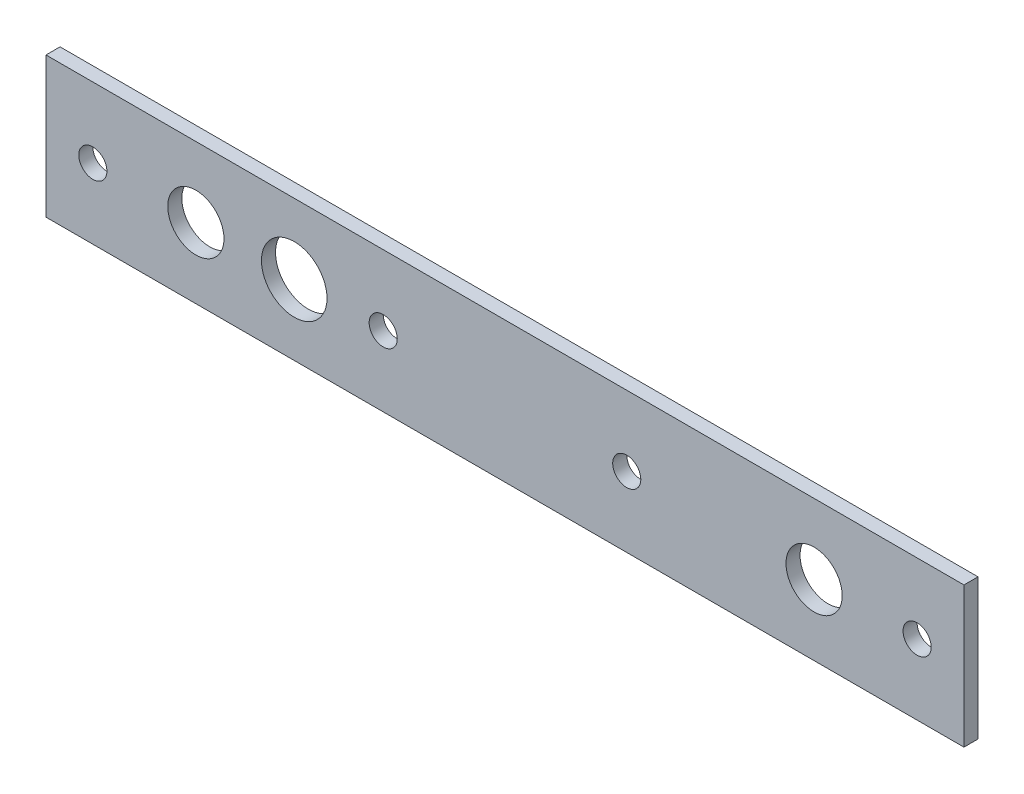
ISO-10303-21;
HEADER;
FILE_DESCRIPTION(('STEP AP214'),'2;1');
FILE_NAME('part.step','',(''),(''),'','','');
FILE_SCHEMA(('AUTOMOTIVE_DESIGN { 1 0 10303 214 1 1 1 1 }'));
ENDSEC;
DATA;
#1=APPLICATION_CONTEXT('core data for automotive mechanical design processes');
#2=APPLICATION_PROTOCOL_DEFINITION('international standard','automotive_design',2000,#1);
#3=PRODUCT_CONTEXT('',#1,'mechanical');
#4=PRODUCT('Part','Part','',(#3));
#5=PRODUCT_RELATED_PRODUCT_CATEGORY('part','',(#4));
#6=PRODUCT_DEFINITION_FORMATION('','',#4);
#7=PRODUCT_DEFINITION_CONTEXT('part definition',#1,'design');
#8=PRODUCT_DEFINITION('design','',#6,#7);
#9=PRODUCT_DEFINITION_SHAPE('','',#8);
#10=(LENGTH_UNIT() NAMED_UNIT(*) SI_UNIT(.MILLI.,.METRE.));
#11=(NAMED_UNIT(*) PLANE_ANGLE_UNIT() SI_UNIT($,.RADIAN.));
#12=(NAMED_UNIT(*) SI_UNIT($,.STERADIAN.) SOLID_ANGLE_UNIT());
#13=UNCERTAINTY_MEASURE_WITH_UNIT(LENGTH_MEASURE(1.E-05),#10,'distance_accuracy_value','');
#14=(GEOMETRIC_REPRESENTATION_CONTEXT(3) GLOBAL_UNCERTAINTY_ASSIGNED_CONTEXT((#13)) GLOBAL_UNIT_ASSIGNED_CONTEXT((#10,
#11,#12)) REPRESENTATION_CONTEXT('',''));
#15=CARTESIAN_POINT('',(0.,0.,0.));
#16=DIRECTION('',(0.,0.,1.));
#17=DIRECTION('',(1.,0.,0.));
#18=AXIS2_PLACEMENT_3D('',#15,#16,#17);
#19=CARTESIAN_POINT('',(53.1831030938484,-21.8181052631579,1.5));
#20=DIRECTION('',(0.,0.,-1.));
#21=DIRECTION('',(-1.,0.,0.));
#22=AXIS2_PLACEMENT_3D('',#19,#20,#21);
#23=PLANE('',#22);
#24=CARTESIAN_POINT('',(48.1831030938484,-14.3181052631579,1.5));
#25=DIRECTION('',(0.,0.,1.));
#26=DIRECTION('',(1.,0.,0.));
#27=AXIS2_PLACEMENT_3D('',#24,#25,#26);
#28=CIRCLE('',#27,1.5);
#29=CARTESIAN_POINT('',(49.6831030938484,-14.3181052631579,1.5));
#30=VERTEX_POINT('',#29);
#31=EDGE_CURVE('E136',#30,#30,#28,.T.);
#32=ORIENTED_EDGE('',*,*,#31,.F.);
#33=EDGE_LOOP('',(#32));
#34=FACE_BOUND('',#33,.T.);
#35=CARTESIAN_POINT('',(-28.8168969061516,-14.3181052631579,1.5));
#36=DIRECTION('',(0.,0.,1.));
#37=DIRECTION('',(1.,0.,0.));
#38=AXIS2_PLACEMENT_3D('',#35,#36,#37);
#39=CIRCLE('',#38,3.);
#40=CARTESIAN_POINT('',(-25.8168969061516,-14.3181052631579,1.5));
#41=VERTEX_POINT('',#40);
#42=EDGE_CURVE('E124',#41,#41,#39,.T.);
#43=ORIENTED_EDGE('',*,*,#42,.F.);
#44=EDGE_LOOP('',(#43));
#45=FACE_BOUND('',#44,.T.);
#46=CARTESIAN_POINT('',(-8.81689690615157,-14.3181052631579,1.5));
#47=DIRECTION('',(0.,0.,1.));
#48=DIRECTION('',(1.,0.,0.));
#49=AXIS2_PLACEMENT_3D('',#46,#47,#48);
#50=CIRCLE('',#49,1.5);
#51=CARTESIAN_POINT('',(-7.31689690615156,-14.3181052631579,1.5));
#52=VERTEX_POINT('',#51);
#53=EDGE_CURVE('E112',#52,#52,#50,.T.);
#54=ORIENTED_EDGE('',*,*,#53,.F.);
#55=EDGE_LOOP('',(#54));
#56=FACE_BOUND('',#55,.T.);
#57=DIRECTION('',(0.,1.,0.));
#58=VECTOR('',#57,1.);
#59=CARTESIAN_POINT('',(53.1831030938484,-6.81810526315789,1.5));
#60=LINE('',#59,#58);
#61=CARTESIAN_POINT('',(53.1831030938484,-21.8181052631579,1.5));
#62=VERTEX_POINT('',#61);
#63=CARTESIAN_POINT('',(53.1831030938484,-6.81810526315789,1.5));
#64=VERTEX_POINT('',#63);
#65=EDGE_CURVE('E82',#62,#64,#60,.T.);
#66=ORIENTED_EDGE('',*,*,#65,.T.);
#67=DIRECTION('',(-1.,0.,0.));
#68=VECTOR('',#67,1.);
#69=CARTESIAN_POINT('',(-44.8168969061516,-6.81810526315789,1.5));
#70=LINE('',#69,#68);
#71=CARTESIAN_POINT('',(-44.8168969061516,-6.81810526315789,1.5));
#72=VERTEX_POINT('',#71);
#73=EDGE_CURVE('E77',#64,#72,#70,.T.);
#74=ORIENTED_EDGE('',*,*,#73,.T.);
#75=DIRECTION('',(0.,-1.,0.));
#76=VECTOR('',#75,1.);
#77=CARTESIAN_POINT('',(-44.8168969061516,-21.8181052631579,1.5));
#78=LINE('',#77,#76);
#79=CARTESIAN_POINT('',(-44.8168969061516,-21.8181052631579,1.5));
#80=VERTEX_POINT('',#79);
#81=EDGE_CURVE('E80',#72,#80,#78,.T.);
#82=ORIENTED_EDGE('',*,*,#81,.T.);
#83=DIRECTION('',(1.,0.,0.));
#84=VECTOR('',#83,1.);
#85=CARTESIAN_POINT('',(53.1831030938484,-21.8181052631579,1.5));
#86=LINE('',#85,#84);
#87=EDGE_CURVE('E47',#80,#62,#86,.T.);
#88=ORIENTED_EDGE('',*,*,#87,.T.);
#89=EDGE_LOOP('',(#66,#74,#82,#88));
#90=FACE_BOUND('',#89,.T.);
#91=CARTESIAN_POINT('',(37.1831030938484,-14.3181052631579,1.5));
#92=DIRECTION('',(0.,0.,1.));
#93=DIRECTION('',(1.,0.,0.));
#94=AXIS2_PLACEMENT_3D('',#91,#92,#93);
#95=CIRCLE('',#94,3.);
#96=CARTESIAN_POINT('',(40.1831030938484,-14.3181052631579,1.5));
#97=VERTEX_POINT('',#96);
#98=EDGE_CURVE('E97',#97,#97,#95,.T.);
#99=ORIENTED_EDGE('',*,*,#98,.F.);
#100=EDGE_LOOP('',(#99));
#101=FACE_BOUND('',#100,.T.);
#102=CARTESIAN_POINT('',(17.1831030938484,-14.3181052631579,1.5));
#103=DIRECTION('',(0.,0.,1.));
#104=DIRECTION('',(1.,0.,0.));
#105=AXIS2_PLACEMENT_3D('',#102,#103,#104);
#106=CIRCLE('',#105,1.5);
#107=CARTESIAN_POINT('',(18.6831030938484,-14.3181052631579,1.5));
#108=VERTEX_POINT('',#107);
#109=EDGE_CURVE('E118',#108,#108,#106,.T.);
#110=ORIENTED_EDGE('',*,*,#109,.F.);
#111=EDGE_LOOP('',(#110));
#112=FACE_BOUND('',#111,.T.);
#113=CARTESIAN_POINT('',(-18.3168969061516,-14.3181052631579,1.5));
#114=DIRECTION('',(0.,0.,1.));
#115=DIRECTION('',(1.,0.,0.));
#116=AXIS2_PLACEMENT_3D('',#113,#114,#115);
#117=CIRCLE('',#116,3.5);
#118=CARTESIAN_POINT('',(-14.8168969061516,-14.3181052631579,1.5));
#119=VERTEX_POINT('',#118);
#120=EDGE_CURVE('E130',#119,#119,#117,.T.);
#121=ORIENTED_EDGE('',*,*,#120,.F.);
#122=EDGE_LOOP('',(#121));
#123=FACE_BOUND('',#122,.T.);
#124=CARTESIAN_POINT('',(-39.8168969061516,-14.3181052631579,1.5));
#125=DIRECTION('',(0.,0.,1.));
#126=DIRECTION('',(1.,0.,0.));
#127=AXIS2_PLACEMENT_3D('',#124,#125,#126);
#128=CIRCLE('',#127,1.5);
#129=CARTESIAN_POINT('',(-38.3168969061516,-14.3181052631579,1.5));
#130=VERTEX_POINT('',#129);
#131=EDGE_CURVE('E142',#130,#130,#128,.T.);
#132=ORIENTED_EDGE('',*,*,#131,.F.);
#133=EDGE_LOOP('',(#132));
#134=FACE_BOUND('',#133,.T.);
#135=ADVANCED_FACE('F30',(#34,#45,#56,#90,#101,#112,#123,#134),#23,.F.);
#136=CARTESIAN_POINT('',(53.1831030938484,-21.8181052631579,0.));
#137=DIRECTION('',(0.,0.,-1.));
#138=DIRECTION('',(-1.,0.,0.));
#139=AXIS2_PLACEMENT_3D('',#136,#137,#138);
#140=PLANE('',#139);
#141=CARTESIAN_POINT('',(48.1831030938484,-14.3181052631579,0.));
#142=DIRECTION('',(0.,0.,1.));
#143=DIRECTION('',(1.,0.,0.));
#144=AXIS2_PLACEMENT_3D('',#141,#142,#143);
#145=CIRCLE('',#144,1.5);
#146=CARTESIAN_POINT('',(49.6831030938484,-14.3181052631579,0.));
#147=VERTEX_POINT('',#146);
#148=EDGE_CURVE('E139',#147,#147,#145,.T.);
#149=ORIENTED_EDGE('',*,*,#148,.T.);
#150=EDGE_LOOP('',(#149));
#151=FACE_BOUND('',#150,.T.);
#152=CARTESIAN_POINT('',(-28.8168969061516,-14.3181052631579,0.));
#153=DIRECTION('',(0.,0.,1.));
#154=DIRECTION('',(1.,0.,0.));
#155=AXIS2_PLACEMENT_3D('',#152,#153,#154);
#156=CIRCLE('',#155,3.);
#157=CARTESIAN_POINT('',(-25.8168969061516,-14.3181052631579,0.));
#158=VERTEX_POINT('',#157);
#159=EDGE_CURVE('E127',#158,#158,#156,.T.);
#160=ORIENTED_EDGE('',*,*,#159,.T.);
#161=EDGE_LOOP('',(#160));
#162=FACE_BOUND('',#161,.T.);
#163=CARTESIAN_POINT('',(-8.81689690615157,-14.3181052631579,0.));
#164=DIRECTION('',(0.,0.,1.));
#165=DIRECTION('',(1.,0.,0.));
#166=AXIS2_PLACEMENT_3D('',#163,#164,#165);
#167=CIRCLE('',#166,1.5);
#168=CARTESIAN_POINT('',(-7.31689690615156,-14.3181052631579,0.));
#169=VERTEX_POINT('',#168);
#170=EDGE_CURVE('E115',#169,#169,#167,.T.);
#171=ORIENTED_EDGE('',*,*,#170,.T.);
#172=EDGE_LOOP('',(#171));
#173=FACE_BOUND('',#172,.T.);
#174=DIRECTION('',(0.,1.,0.));
#175=VECTOR('',#174,1.);
#176=CARTESIAN_POINT('',(53.1831030938484,-6.81810526315789,0.));
#177=LINE('',#176,#175);
#178=CARTESIAN_POINT('',(53.1831030938484,-21.8181052631579,0.));
#179=VERTEX_POINT('',#178);
#180=CARTESIAN_POINT('',(53.1831030938484,-6.81810526315789,0.));
#181=VERTEX_POINT('',#180);
#182=EDGE_CURVE('E94',#179,#181,#177,.T.);
#183=ORIENTED_EDGE('',*,*,#182,.F.);
#184=DIRECTION('',(1.,0.,0.));
#185=VECTOR('',#184,1.);
#186=CARTESIAN_POINT('',(53.1831030938484,-21.8181052631579,0.));
#187=LINE('',#186,#185);
#188=CARTESIAN_POINT('',(-44.8168969061516,-21.8181052631579,0.));
#189=VERTEX_POINT('',#188);
#190=EDGE_CURVE('E70',#189,#179,#187,.T.);
#191=ORIENTED_EDGE('',*,*,#190,.F.);
#192=DIRECTION('',(0.,-1.,0.));
#193=VECTOR('',#192,1.);
#194=CARTESIAN_POINT('',(-44.8168969061516,-21.8181052631579,0.));
#195=LINE('',#194,#193);
#196=CARTESIAN_POINT('',(-44.8168969061516,-6.81810526315789,0.));
#197=VERTEX_POINT('',#196);
#198=EDGE_CURVE('E64',#197,#189,#195,.T.);
#199=ORIENTED_EDGE('',*,*,#198,.F.);
#200=DIRECTION('',(-1.,0.,0.));
#201=VECTOR('',#200,1.);
#202=CARTESIAN_POINT('',(-44.8168969061516,-6.81810526315789,0.));
#203=LINE('',#202,#201);
#204=EDGE_CURVE('E86',#181,#197,#203,.T.);
#205=ORIENTED_EDGE('',*,*,#204,.F.);
#206=EDGE_LOOP('',(#183,#191,#199,#205));
#207=FACE_BOUND('',#206,.T.);
#208=CARTESIAN_POINT('',(37.1831030938484,-14.3181052631579,0.));
#209=DIRECTION('',(0.,0.,1.));
#210=DIRECTION('',(1.,0.,0.));
#211=AXIS2_PLACEMENT_3D('',#208,#209,#210);
#212=CIRCLE('',#211,3.);
#213=CARTESIAN_POINT('',(40.1831030938484,-14.3181052631579,0.));
#214=VERTEX_POINT('',#213);
#215=EDGE_CURVE('E109',#214,#214,#212,.T.);
#216=ORIENTED_EDGE('',*,*,#215,.T.);
#217=EDGE_LOOP('',(#216));
#218=FACE_BOUND('',#217,.T.);
#219=CARTESIAN_POINT('',(17.1831030938484,-14.3181052631579,0.));
#220=DIRECTION('',(0.,0.,1.));
#221=DIRECTION('',(1.,0.,0.));
#222=AXIS2_PLACEMENT_3D('',#219,#220,#221);
#223=CIRCLE('',#222,1.5);
#224=CARTESIAN_POINT('',(18.6831030938484,-14.3181052631579,0.));
#225=VERTEX_POINT('',#224);
#226=EDGE_CURVE('E121',#225,#225,#223,.T.);
#227=ORIENTED_EDGE('',*,*,#226,.T.);
#228=EDGE_LOOP('',(#227));
#229=FACE_BOUND('',#228,.T.);
#230=CARTESIAN_POINT('',(-18.3168969061516,-14.3181052631579,0.));
#231=DIRECTION('',(0.,0.,1.));
#232=DIRECTION('',(1.,0.,0.));
#233=AXIS2_PLACEMENT_3D('',#230,#231,#232);
#234=CIRCLE('',#233,3.5);
#235=CARTESIAN_POINT('',(-14.8168969061516,-14.3181052631579,0.));
#236=VERTEX_POINT('',#235);
#237=EDGE_CURVE('E133',#236,#236,#234,.T.);
#238=ORIENTED_EDGE('',*,*,#237,.T.);
#239=EDGE_LOOP('',(#238));
#240=FACE_BOUND('',#239,.T.);
#241=CARTESIAN_POINT('',(-39.8168969061516,-14.3181052631579,0.));
#242=DIRECTION('',(0.,0.,1.));
#243=DIRECTION('',(1.,0.,0.));
#244=AXIS2_PLACEMENT_3D('',#241,#242,#243);
#245=CIRCLE('',#244,1.5);
#246=CARTESIAN_POINT('',(-38.3168969061516,-14.3181052631579,0.));
#247=VERTEX_POINT('',#246);
#248=EDGE_CURVE('E145',#247,#247,#245,.T.);
#249=ORIENTED_EDGE('',*,*,#248,.T.);
#250=EDGE_LOOP('',(#249));
#251=FACE_BOUND('',#250,.T.);
#252=ADVANCED_FACE('F105',(#151,#162,#173,#207,#218,#229,#240,#251),#140,.T.);
#253=CARTESIAN_POINT('',(53.1831030938484,-6.81810526315789,1.5));
#254=DIRECTION('',(-1.,0.,0.));
#255=DIRECTION('',(0.,0.,1.));
#256=AXIS2_PLACEMENT_3D('',#253,#254,#255);
#257=PLANE('',#256);
#258=ORIENTED_EDGE('',*,*,#182,.T.);
#259=DIRECTION('',(0.,0.,-1.));
#260=VECTOR('',#259,1.);
#261=CARTESIAN_POINT('',(53.1831030938484,-6.81810526315789,1.5));
#262=LINE('',#261,#260);
#263=EDGE_CURVE('E11',#64,#181,#262,.T.);
#264=ORIENTED_EDGE('',*,*,#263,.F.);
#265=ORIENTED_EDGE('',*,*,#65,.F.);
#266=DIRECTION('',(0.,0.,-1.));
#267=VECTOR('',#266,1.);
#268=CARTESIAN_POINT('',(53.1831030938484,-21.8181052631579,1.5));
#269=LINE('',#268,#267);
#270=EDGE_CURVE('E90',#62,#179,#269,.T.);
#271=ORIENTED_EDGE('',*,*,#270,.T.);
#272=EDGE_LOOP('',(#258,#264,#265,#271));
#273=FACE_BOUND('',#272,.T.);
#274=ADVANCED_FACE('F32',(#273),#257,.F.);
#275=CARTESIAN_POINT('',(-44.8168969061516,-6.81810526315789,1.5));
#276=DIRECTION('',(0.,-1.,0.));
#277=DIRECTION('',(0.,0.,-1.));
#278=AXIS2_PLACEMENT_3D('',#275,#276,#277);
#279=PLANE('',#278);
#280=ORIENTED_EDGE('',*,*,#204,.T.);
#281=DIRECTION('',(0.,0.,-1.));
#282=VECTOR('',#281,1.);
#283=CARTESIAN_POINT('',(-44.8168969061516,-6.81810526315789,1.5));
#284=LINE('',#283,#282);
#285=EDGE_CURVE('E39',#72,#197,#284,.T.);
#286=ORIENTED_EDGE('',*,*,#285,.F.);
#287=ORIENTED_EDGE('',*,*,#73,.F.);
#288=ORIENTED_EDGE('',*,*,#263,.T.);
#289=EDGE_LOOP('',(#280,#286,#287,#288));
#290=FACE_BOUND('',#289,.T.);
#291=ADVANCED_FACE('F85',(#290),#279,.F.);
#292=CARTESIAN_POINT('',(-44.8168969061516,-21.8181052631579,1.5));
#293=DIRECTION('',(1.,0.,0.));
#294=DIRECTION('',(0.,0.,-1.));
#295=AXIS2_PLACEMENT_3D('',#292,#293,#294);
#296=PLANE('',#295);
#297=ORIENTED_EDGE('',*,*,#198,.T.);
#298=DIRECTION('',(0.,0.,-1.));
#299=VECTOR('',#298,1.);
#300=CARTESIAN_POINT('',(-44.8168969061516,-21.8181052631579,1.5));
#301=LINE('',#300,#299);
#302=EDGE_CURVE('E87',#80,#189,#301,.T.);
#303=ORIENTED_EDGE('',*,*,#302,.F.);
#304=ORIENTED_EDGE('',*,*,#81,.F.);
#305=ORIENTED_EDGE('',*,*,#285,.T.);
#306=EDGE_LOOP('',(#297,#303,#304,#305));
#307=FACE_BOUND('',#306,.T.);
#308=ADVANCED_FACE('F88',(#307),#296,.F.);
#309=CARTESIAN_POINT('',(53.1831030938484,-21.8181052631579,1.5));
#310=DIRECTION('',(0.,1.,0.));
#311=DIRECTION('',(-1.,0.,0.));
#312=AXIS2_PLACEMENT_3D('',#309,#310,#311);
#313=PLANE('',#312);
#314=ORIENTED_EDGE('',*,*,#190,.T.);
#315=ORIENTED_EDGE('',*,*,#270,.F.);
#316=ORIENTED_EDGE('',*,*,#87,.F.);
#317=ORIENTED_EDGE('',*,*,#302,.T.);
#318=EDGE_LOOP('',(#314,#315,#316,#317));
#319=FACE_BOUND('',#318,.T.);
#320=ADVANCED_FACE('F102',(#319),#313,.F.);
#321=CARTESIAN_POINT('',(37.1831030938484,-14.3181052631579,1.5));
#322=DIRECTION('',(0.,0.,-1.));
#323=DIRECTION('',(-1.,0.,0.));
#324=AXIS2_PLACEMENT_3D('',#321,#322,#323);
#325=CYLINDRICAL_SURFACE('',#324,3.);
#326=ORIENTED_EDGE('',*,*,#98,.T.);
#327=EDGE_LOOP('',(#326));
#328=FACE_BOUND('',#327,.T.);
#329=ORIENTED_EDGE('',*,*,#215,.F.);
#330=EDGE_LOOP('',(#329));
#331=FACE_BOUND('',#330,.T.);
#332=ADVANCED_FACE('F165',(#328,#331),#325,.F.);
#333=CARTESIAN_POINT('',(-8.81689690615157,-14.3181052631579,1.5));
#334=DIRECTION('',(0.,0.,-1.));
#335=DIRECTION('',(-1.,0.,0.));
#336=AXIS2_PLACEMENT_3D('',#333,#334,#335);
#337=CYLINDRICAL_SURFACE('',#336,1.5);
#338=ORIENTED_EDGE('',*,*,#53,.T.);
#339=EDGE_LOOP('',(#338));
#340=FACE_BOUND('',#339,.T.);
#341=ORIENTED_EDGE('',*,*,#170,.F.);
#342=EDGE_LOOP('',(#341));
#343=FACE_BOUND('',#342,.T.);
#344=ADVANCED_FACE('F211',(#340,#343),#337,.F.);
#345=CARTESIAN_POINT('',(17.1831030938484,-14.3181052631579,1.5));
#346=DIRECTION('',(0.,0.,-1.));
#347=DIRECTION('',(-1.,0.,0.));
#348=AXIS2_PLACEMENT_3D('',#345,#346,#347);
#349=CYLINDRICAL_SURFACE('',#348,1.5);
#350=ORIENTED_EDGE('',*,*,#109,.T.);
#351=EDGE_LOOP('',(#350));
#352=FACE_BOUND('',#351,.T.);
#353=ORIENTED_EDGE('',*,*,#226,.F.);
#354=EDGE_LOOP('',(#353));
#355=FACE_BOUND('',#354,.T.);
#356=ADVANCED_FACE('F219',(#352,#355),#349,.F.);
#357=CARTESIAN_POINT('',(-28.8168969061516,-14.3181052631579,1.5));
#358=DIRECTION('',(0.,0.,-1.));
#359=DIRECTION('',(-1.,0.,0.));
#360=AXIS2_PLACEMENT_3D('',#357,#358,#359);
#361=CYLINDRICAL_SURFACE('',#360,3.);
#362=ORIENTED_EDGE('',*,*,#42,.T.);
#363=EDGE_LOOP('',(#362));
#364=FACE_BOUND('',#363,.T.);
#365=ORIENTED_EDGE('',*,*,#159,.F.);
#366=EDGE_LOOP('',(#365));
#367=FACE_BOUND('',#366,.T.);
#368=ADVANCED_FACE('F227',(#364,#367),#361,.F.);
#369=CARTESIAN_POINT('',(-18.3168969061516,-14.3181052631579,1.5));
#370=DIRECTION('',(0.,0.,-1.));
#371=DIRECTION('',(-1.,0.,0.));
#372=AXIS2_PLACEMENT_3D('',#369,#370,#371);
#373=CYLINDRICAL_SURFACE('',#372,3.5);
#374=ORIENTED_EDGE('',*,*,#120,.T.);
#375=EDGE_LOOP('',(#374));
#376=FACE_BOUND('',#375,.T.);
#377=ORIENTED_EDGE('',*,*,#237,.F.);
#378=EDGE_LOOP('',(#377));
#379=FACE_BOUND('',#378,.T.);
#380=ADVANCED_FACE('F236',(#376,#379),#373,.F.);
#381=CARTESIAN_POINT('',(48.1831030938484,-14.3181052631579,1.5));
#382=DIRECTION('',(0.,0.,-1.));
#383=DIRECTION('',(-1.,0.,0.));
#384=AXIS2_PLACEMENT_3D('',#381,#382,#383);
#385=CYLINDRICAL_SURFACE('',#384,1.5);
#386=ORIENTED_EDGE('',*,*,#31,.T.);
#387=EDGE_LOOP('',(#386));
#388=FACE_BOUND('',#387,.T.);
#389=ORIENTED_EDGE('',*,*,#148,.F.);
#390=EDGE_LOOP('',(#389));
#391=FACE_BOUND('',#390,.T.);
#392=ADVANCED_FACE('F245',(#388,#391),#385,.F.);
#393=CARTESIAN_POINT('',(-39.8168969061516,-14.3181052631579,1.5));
#394=DIRECTION('',(0.,0.,-1.));
#395=DIRECTION('',(-1.,0.,0.));
#396=AXIS2_PLACEMENT_3D('',#393,#394,#395);
#397=CYLINDRICAL_SURFACE('',#396,1.5);
#398=ORIENTED_EDGE('',*,*,#131,.T.);
#399=EDGE_LOOP('',(#398));
#400=FACE_BOUND('',#399,.T.);
#401=ORIENTED_EDGE('',*,*,#248,.F.);
#402=EDGE_LOOP('',(#401));
#403=FACE_BOUND('',#402,.T.);
#404=ADVANCED_FACE('F151',(#400,#403),#397,.F.);
#405=CLOSED_SHELL('',(#135,#252,#274,#291,#308,#320,#332,#344,#356,#368,#380,#392,#404));
#406=MANIFOLD_SOLID_BREP('B2',#405);
#407=ADVANCED_BREP_SHAPE_REPRESENTATION('',(#18,#406),#14);
#408=SHAPE_DEFINITION_REPRESENTATION(#9,#407);
ENDSEC;
END-ISO-10303-21;
